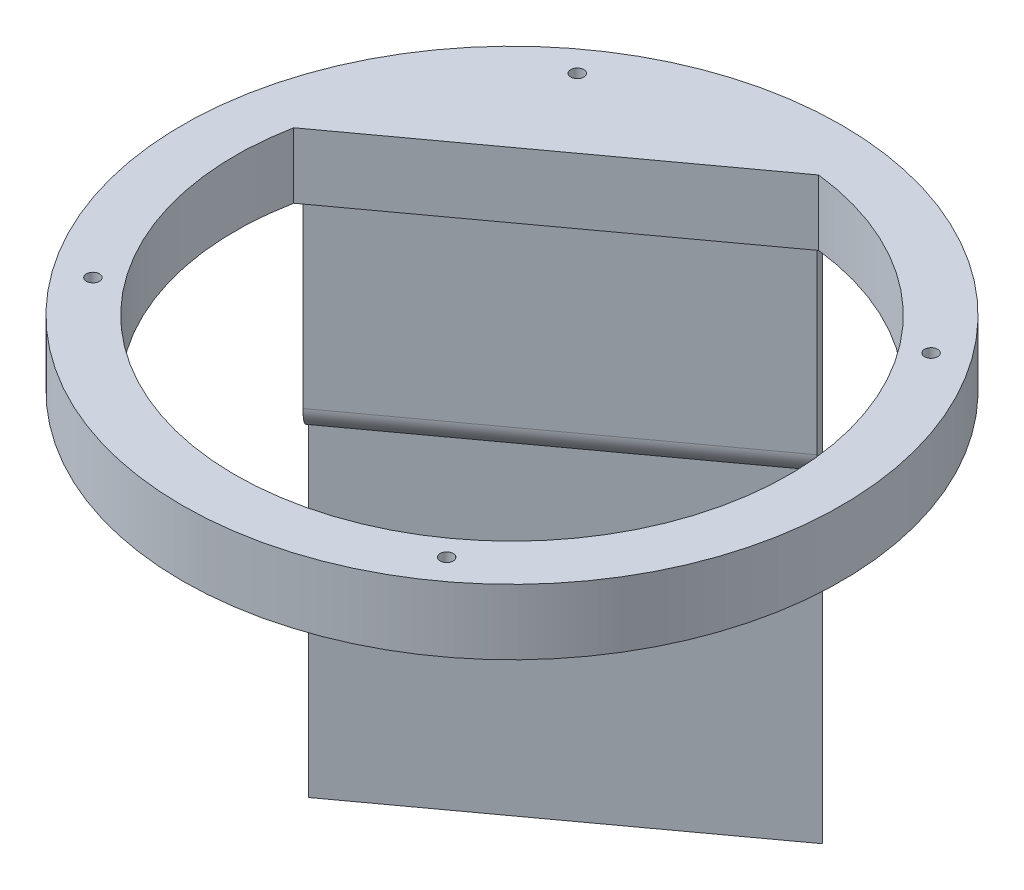
ISO-10303-21;
HEADER;
FILE_DESCRIPTION(('STEP AP214'),'2;1');
FILE_NAME('part.step','',(''),(''),'','','');
FILE_SCHEMA(('AUTOMOTIVE_DESIGN { 1 0 10303 214 1 1 1 1 }'));
ENDSEC;
DATA;
#1=APPLICATION_CONTEXT('core data for automotive mechanical design processes');
#2=APPLICATION_PROTOCOL_DEFINITION('international standard','automotive_design',2000,#1);
#3=PRODUCT_CONTEXT('',#1,'mechanical');
#4=PRODUCT('Part','Part','',(#3));
#5=PRODUCT_RELATED_PRODUCT_CATEGORY('part','',(#4));
#6=PRODUCT_DEFINITION_FORMATION('','',#4);
#7=PRODUCT_DEFINITION_CONTEXT('part definition',#1,'design');
#8=PRODUCT_DEFINITION('design','',#6,#7);
#9=PRODUCT_DEFINITION_SHAPE('','',#8);
#10=(LENGTH_UNIT() NAMED_UNIT(*) SI_UNIT(.MILLI.,.METRE.));
#11=(NAMED_UNIT(*) PLANE_ANGLE_UNIT() SI_UNIT($,.RADIAN.));
#12=(NAMED_UNIT(*) SI_UNIT($,.STERADIAN.) SOLID_ANGLE_UNIT());
#13=UNCERTAINTY_MEASURE_WITH_UNIT(LENGTH_MEASURE(1.E-05),#10,'distance_accuracy_value','');
#14=(GEOMETRIC_REPRESENTATION_CONTEXT(3) GLOBAL_UNCERTAINTY_ASSIGNED_CONTEXT((#13)) GLOBAL_UNIT_ASSIGNED_CONTEXT((#10,
#11,#12)) REPRESENTATION_CONTEXT('',''));
#15=CARTESIAN_POINT('',(0.,0.,0.));
#16=DIRECTION('',(0.,0.,1.));
#17=DIRECTION('',(1.,0.,0.));
#18=AXIS2_PLACEMENT_3D('',#15,#16,#17);
#19=CARTESIAN_POINT('',(0.,0.,0.));
#20=DIRECTION('',(0.,1.,0.));
#21=DIRECTION('',(0.,0.,1.));
#22=AXIS2_PLACEMENT_3D('',#19,#20,#21);
#23=PLANE('',#22);
#24=CARTESIAN_POINT('',(0.,0.,0.));
#25=DIRECTION('',(0.,1.,0.));
#26=DIRECTION('',(0.,0.,1.));
#27=AXIS2_PLACEMENT_3D('',#24,#25,#26);
#28=CIRCLE('',#27,75.63);
#29=CARTESIAN_POINT('',(0.,0.,75.63));
#30=VERTEX_POINT('',#29);
#31=EDGE_CURVE('E219',#30,#30,#28,.T.);
#32=ORIENTED_EDGE('',*,*,#31,.F.);
#33=EDGE_LOOP('',(#32));
#34=FACE_BOUND('',#33,.T.);
#35=CARTESIAN_POINT('',(0.,0.,0.));
#36=DIRECTION('',(0.,1.,0.));
#37=DIRECTION('',(0.,0.,1.));
#38=AXIS2_PLACEMENT_3D('',#35,#36,#37);
#39=CIRCLE('',#38,63.5);
#40=CARTESIAN_POINT('',(-62.3118029306201,0.,-12.2265782431375));
#41=VERTEX_POINT('',#40);
#42=CARTESIAN_POINT('',(7.31306950931665,0.,-63.0774842107063));
#43=VERTEX_POINT('',#42);
#44=EDGE_CURVE('E216',#41,#43,#39,.T.);
#45=ORIENTED_EDGE('',*,*,#44,.T.);
#46=DIRECTION('',(-0.807550267601541,0.,0.589798749826311));
#47=VECTOR('',#46,1.);
#48=CARTESIAN_POINT('',(7.31306950931663,0.,-63.0774842107063));
#49=LINE('',#48,#47);
#50=EDGE_CURVE('E205',#43,#41,#49,.T.);
#51=ORIENTED_EDGE('',*,*,#50,.T.);
#52=EDGE_LOOP('',(#45,#51));
#53=FACE_BOUND('',#52,.T.);
#54=CARTESIAN_POINT('',(-40.5928989567965,0.,-55.5796471676757));
#55=DIRECTION('',(0.,1.,0.));
#56=DIRECTION('',(0.,0.,1.));
#57=AXIS2_PLACEMENT_3D('',#54,#55,#56);
#58=CIRCLE('',#57,1.50000000000001);
#59=CARTESIAN_POINT('',(-40.5928989567965,0.,-54.0796471676757));
#60=VERTEX_POINT('',#59);
#61=EDGE_CURVE('E138',#60,#60,#58,.F.);
#62=ORIENTED_EDGE('',*,*,#61,.F.);
#63=EDGE_LOOP('',(#62));
#64=FACE_BOUND('',#63,.T.);
#65=CARTESIAN_POINT('',(55.5796471676757,0.,-40.5928989567965));
#66=DIRECTION('',(0.,1.,0.));
#67=DIRECTION('',(0.,0.,1.));
#68=AXIS2_PLACEMENT_3D('',#65,#66,#67);
#69=CIRCLE('',#68,1.5);
#70=CARTESIAN_POINT('',(55.5796471676757,0.,-39.0928989567965));
#71=VERTEX_POINT('',#70);
#72=EDGE_CURVE('E167',#71,#71,#69,.F.);
#73=ORIENTED_EDGE('',*,*,#72,.F.);
#74=EDGE_LOOP('',(#73));
#75=FACE_BOUND('',#74,.T.);
#76=CARTESIAN_POINT('',(-55.5796471676757,0.,40.5928989567965));
#77=DIRECTION('',(0.,1.,0.));
#78=DIRECTION('',(0.,0.,1.));
#79=AXIS2_PLACEMENT_3D('',#76,#77,#78);
#80=CIRCLE('',#79,1.5);
#81=CARTESIAN_POINT('',(-55.5796471676757,0.,42.0928989567965));
#82=VERTEX_POINT('',#81);
#83=EDGE_CURVE('E161',#82,#82,#80,.F.);
#84=ORIENTED_EDGE('',*,*,#83,.F.);
#85=EDGE_LOOP('',(#84));
#86=FACE_BOUND('',#85,.T.);
#87=CARTESIAN_POINT('',(40.5928989567965,0.,55.5796471676757));
#88=DIRECTION('',(0.,1.,0.));
#89=DIRECTION('',(0.,0.,1.));
#90=AXIS2_PLACEMENT_3D('',#87,#88,#89);
#91=CIRCLE('',#90,1.5);
#92=CARTESIAN_POINT('',(40.5928989567965,0.,57.0796471676757));
#93=VERTEX_POINT('',#92);
#94=EDGE_CURVE('E156',#93,#93,#91,.F.);
#95=ORIENTED_EDGE('',*,*,#94,.F.);
#96=EDGE_LOOP('',(#95));
#97=FACE_BOUND('',#96,.T.);
#98=DIRECTION('',(-0.589798749826309,0.,-0.807550267601542));
#99=VECTOR('',#98,1.);
#100=CARTESIAN_POINT('',(4.22637396438412,0.,-65.7763512830651));
#101=LINE('',#100,#99);
#102=CARTESIAN_POINT('',(4.22637396438412,0.,-65.7763512830651));
#103=VERTEX_POINT('',#102);
#104=CARTESIAN_POINT('',(0.687581465426267,0.,-70.6216528886744));
#105=VERTEX_POINT('',#104);
#106=EDGE_CURVE('E131',#103,#105,#101,.T.);
#107=ORIENTED_EDGE('',*,*,#106,.T.);
#108=CARTESIAN_POINT('',(0.,0.,0.));
#109=DIRECTION('',(0.,-1.,0.));
#110=DIRECTION('',(0.,0.,-1.));
#111=AXIS2_PLACEMENT_3D('',#108,#109,#110);
#112=CIRCLE('',#111,70.625);
#113=CARTESIAN_POINT('',(-15.1111896962606,0.,-68.9894381116677));
#114=VERTEX_POINT('',#113);
#115=EDGE_CURVE('E190',#114,#105,#112,.T.);
#116=ORIENTED_EDGE('',*,*,#115,.F.);
#117=DIRECTION('',(0.807550267601542,0.,-0.58979874982631));
#118=VECTOR('',#117,1.);
#119=CARTESIAN_POINT('',(-38.1157442075253,0.,-52.1879360437496));
#120=LINE('',#119,#118);
#121=CARTESIAN_POINT('',(-61.1202987187899,0.,-35.3864339758316));
#122=VERTEX_POINT('',#121);
#123=EDGE_CURVE('E160',#122,#114,#120,.T.);
#124=ORIENTED_EDGE('',*,*,#123,.F.);
#125=CARTESIAN_POINT('',(-67.4822898832558,0.,-20.8334149172004));
#126=VERTEX_POINT('',#125);
#127=EDGE_CURVE('E195',#126,#122,#112,.T.);
#128=ORIENTED_EDGE('',*,*,#127,.F.);
#129=DIRECTION('',(-0.589798749826309,0.,-0.807550267601542));
#130=VECTOR('',#129,1.);
#131=CARTESIAN_POINT('',(-63.943497384298,0.,-15.9881133115911));
#132=LINE('',#131,#130);
#133=CARTESIAN_POINT('',(-63.943497384298,0.,-15.9881133115911));
#134=VERTEX_POINT('',#133);
#135=EDGE_CURVE('E139',#134,#126,#132,.T.);
#136=ORIENTED_EDGE('',*,*,#135,.F.);
#137=DIRECTION('',(-0.807550267601542,0.,0.58979874982631));
#138=VECTOR('',#137,1.);
#139=CARTESIAN_POINT('',(-29.8585617099569,0.,-40.8822322973281));
#140=LINE('',#139,#138);
#141=EDGE_CURVE('E125',#103,#134,#140,.T.);
#142=ORIENTED_EDGE('',*,*,#141,.F.);
#143=EDGE_LOOP('',(#107,#116,#124,#128,#136,#142));
#144=FACE_BOUND('',#143,.T.);
#145=ADVANCED_FACE('F54',(#34,#53,#64,#75,#86,#97,#144),#23,.F.);
#146=CARTESIAN_POINT('',(0.,15.,0.));
#147=DIRECTION('',(0.,-1.,0.));
#148=DIRECTION('',(0.,0.,-1.));
#149=AXIS2_PLACEMENT_3D('',#146,#147,#148);
#150=CYLINDRICAL_SURFACE('',#149,75.63);
#151=CARTESIAN_POINT('',(0.,15.,0.));
#152=DIRECTION('',(0.,1.,0.));
#153=DIRECTION('',(0.,0.,1.));
#154=AXIS2_PLACEMENT_3D('',#151,#152,#153);
#155=CIRCLE('',#154,75.63);
#156=CARTESIAN_POINT('',(0.,15.,75.63));
#157=VERTEX_POINT('',#156);
#158=EDGE_CURVE('E222',#157,#157,#155,.T.);
#159=ORIENTED_EDGE('',*,*,#158,.F.);
#160=EDGE_LOOP('',(#159));
#161=FACE_BOUND('',#160,.T.);
#162=ORIENTED_EDGE('',*,*,#31,.T.);
#163=EDGE_LOOP('',(#162));
#164=FACE_BOUND('',#163,.T.);
#165=ADVANCED_FACE('F229',(#161,#164),#150,.T.);
#166=CARTESIAN_POINT('',(0.,15.,0.));
#167=DIRECTION('',(0.,1.,0.));
#168=DIRECTION('',(0.,0.,1.));
#169=AXIS2_PLACEMENT_3D('',#166,#167,#168);
#170=PLANE('',#169);
#171=CARTESIAN_POINT('',(40.5928989567965,15.,55.5796471676757));
#172=DIRECTION('',(0.,1.,0.));
#173=DIRECTION('',(0.,0.,1.));
#174=AXIS2_PLACEMENT_3D('',#171,#172,#173);
#175=CIRCLE('',#174,1.5);
#176=CARTESIAN_POINT('',(40.5928989567965,15.,57.0796471676757));
#177=VERTEX_POINT('',#176);
#178=EDGE_CURVE('E153',#177,#177,#175,.T.);
#179=ORIENTED_EDGE('',*,*,#178,.F.);
#180=EDGE_LOOP('',(#179));
#181=FACE_BOUND('',#180,.T.);
#182=CARTESIAN_POINT('',(-55.5796471676757,15.,40.5928989567965));
#183=DIRECTION('',(0.,1.,0.));
#184=DIRECTION('',(0.,0.,1.));
#185=AXIS2_PLACEMENT_3D('',#182,#183,#184);
#186=CIRCLE('',#185,1.5);
#187=CARTESIAN_POINT('',(-55.5796471676757,15.,42.0928989567965));
#188=VERTEX_POINT('',#187);
#189=EDGE_CURVE('E157',#188,#188,#186,.T.);
#190=ORIENTED_EDGE('',*,*,#189,.F.);
#191=EDGE_LOOP('',(#190));
#192=FACE_BOUND('',#191,.T.);
#193=CARTESIAN_POINT('',(55.5796471676757,15.,-40.5928989567965));
#194=DIRECTION('',(0.,1.,0.));
#195=DIRECTION('',(0.,0.,1.));
#196=AXIS2_PLACEMENT_3D('',#193,#194,#195);
#197=CIRCLE('',#196,1.5);
#198=CARTESIAN_POINT('',(55.5796471676757,15.,-39.0928989567965));
#199=VERTEX_POINT('',#198);
#200=EDGE_CURVE('E164',#199,#199,#197,.T.);
#201=ORIENTED_EDGE('',*,*,#200,.F.);
#202=EDGE_LOOP('',(#201));
#203=FACE_BOUND('',#202,.T.);
#204=CARTESIAN_POINT('',(-40.5928989567965,15.,-55.5796471676757));
#205=DIRECTION('',(0.,1.,0.));
#206=DIRECTION('',(0.,0.,1.));
#207=AXIS2_PLACEMENT_3D('',#204,#205,#206);
#208=CIRCLE('',#207,1.50000000000001);
#209=CARTESIAN_POINT('',(-40.5928989567965,15.,-54.0796471676757));
#210=VERTEX_POINT('',#209);
#211=EDGE_CURVE('E170',#210,#210,#208,.T.);
#212=ORIENTED_EDGE('',*,*,#211,.F.);
#213=EDGE_LOOP('',(#212));
#214=FACE_BOUND('',#213,.T.);
#215=CARTESIAN_POINT('',(0.,15.,0.));
#216=DIRECTION('',(0.,1.,0.));
#217=DIRECTION('',(0.,0.,1.));
#218=AXIS2_PLACEMENT_3D('',#215,#216,#217);
#219=CIRCLE('',#218,63.5);
#220=CARTESIAN_POINT('',(-62.3118029306201,15.,-12.2265782431375));
#221=VERTEX_POINT('',#220);
#222=CARTESIAN_POINT('',(7.31306950931665,15.,-63.0774842107063));
#223=VERTEX_POINT('',#222);
#224=EDGE_CURVE('E215',#221,#223,#219,.T.);
#225=ORIENTED_EDGE('',*,*,#224,.F.);
#226=DIRECTION('',(-0.807550267601541,0.,0.589798749826311));
#227=VECTOR('',#226,1.);
#228=CARTESIAN_POINT('',(7.31306950931663,15.,-63.0774842107063));
#229=LINE('',#228,#227);
#230=EDGE_CURVE('E209',#223,#221,#229,.T.);
#231=ORIENTED_EDGE('',*,*,#230,.F.);
#232=EDGE_LOOP('',(#225,#231));
#233=FACE_BOUND('',#232,.T.);
#234=ORIENTED_EDGE('',*,*,#158,.T.);
#235=EDGE_LOOP('',(#234));
#236=FACE_BOUND('',#235,.T.);
#237=ADVANCED_FACE('F251',(#181,#192,#203,#214,#233,#236),#170,.T.);
#238=CARTESIAN_POINT('',(0.,0.,0.));
#239=DIRECTION('',(0.,1.,0.));
#240=DIRECTION('',(0.,0.,1.));
#241=AXIS2_PLACEMENT_3D('',#238,#239,#240);
#242=CYLINDRICAL_SURFACE('',#241,63.5);
#243=ORIENTED_EDGE('',*,*,#224,.T.);
#244=DIRECTION('',(0.,-1.,0.));
#245=VECTOR('',#244,1.);
#246=CARTESIAN_POINT('',(7.31306950931665,101.467257623534,-63.0774842107063));
#247=LINE('',#246,#245);
#248=EDGE_CURVE('E208',#223,#43,#247,.T.);
#249=ORIENTED_EDGE('',*,*,#248,.T.);
#250=ORIENTED_EDGE('',*,*,#44,.F.);
#251=DIRECTION('',(0.,-1.,0.));
#252=VECTOR('',#251,1.);
#253=CARTESIAN_POINT('',(-62.3118029306201,101.467257623534,-12.2265782431375));
#254=LINE('',#253,#252);
#255=EDGE_CURVE('E211',#221,#41,#254,.T.);
#256=ORIENTED_EDGE('',*,*,#255,.F.);
#257=EDGE_LOOP('',(#243,#249,#250,#256));
#258=FACE_BOUND('',#257,.T.);
#259=ADVANCED_FACE('F254',(#258),#242,.F.);
#260=CARTESIAN_POINT('',(7.31306950931663,101.467257623534,-63.0774842107063));
#261=DIRECTION('',(0.589798749826311,0.,0.807550267601541));
#262=DIRECTION('',(0.807550267601541,0.,-0.589798749826311));
#263=AXIS2_PLACEMENT_3D('',#260,#261,#262);
#264=PLANE('',#263);
#265=ORIENTED_EDGE('',*,*,#248,.F.);
#266=ORIENTED_EDGE('',*,*,#230,.T.);
#267=ORIENTED_EDGE('',*,*,#255,.T.);
#268=ORIENTED_EDGE('',*,*,#50,.F.);
#269=EDGE_LOOP('',(#265,#266,#267,#268));
#270=FACE_BOUND('',#269,.T.);
#271=ADVANCED_FACE('F273',(#270),#264,.T.);
#272=CARTESIAN_POINT('',(-33.3973542089148,-125.,-45.7275339029373));
#273=DIRECTION('',(0.58979874982631,0.,0.807550267601542));
#274=DIRECTION('',(0.807550267601542,0.,-0.58979874982631));
#275=AXIS2_PLACEMENT_3D('',#272,#273,#274);
#276=PLANE('',#275);
#277=DIRECTION('',(-0.807550267601542,0.,0.58979874982631));
#278=VECTOR('',#277,1.);
#279=CARTESIAN_POINT('',(-33.3973542089148,-49.5,-45.7275339029374));
#280=LINE('',#279,#278);
#281=CARTESIAN_POINT('',(0.687581465426268,-49.5,-70.6216528886744));
#282=VERTEX_POINT('',#281);
#283=CARTESIAN_POINT('',(-67.4822898832558,-49.5,-20.8334149172004));
#284=VERTEX_POINT('',#283);
#285=EDGE_CURVE('E147',#282,#284,#280,.T.);
#286=ORIENTED_EDGE('',*,*,#285,.T.);
#287=DIRECTION('',(0.,1.,0.));
#288=VECTOR('',#287,1.);
#289=CARTESIAN_POINT('',(-67.4822898832558,-125.,-20.8334149172004));
#290=LINE('',#289,#288);
#291=CARTESIAN_POINT('',(-67.4822898832558,-125.,-20.8334149172004));
#292=VERTEX_POINT('',#291);
#293=EDGE_CURVE('E202',#292,#284,#290,.T.);
#294=ORIENTED_EDGE('',*,*,#293,.F.);
#295=DIRECTION('',(0.807550267601542,0.,-0.58979874982631));
#296=VECTOR('',#295,1.);
#297=CARTESIAN_POINT('',(-33.3973542089148,-125.,-45.7275339029373));
#298=LINE('',#297,#296);
#299=CARTESIAN_POINT('',(0.687581465426287,-125.,-70.6216528886743));
#300=VERTEX_POINT('',#299);
#301=EDGE_CURVE('E191',#292,#300,#298,.T.);
#302=ORIENTED_EDGE('',*,*,#301,.T.);
#303=DIRECTION('',(0.,1.,0.));
#304=VECTOR('',#303,1.);
#305=CARTESIAN_POINT('',(0.687581465426287,-125.,-70.6216528886743));
#306=LINE('',#305,#304);
#307=EDGE_CURVE('E197',#300,#282,#306,.T.);
#308=ORIENTED_EDGE('',*,*,#307,.T.);
#309=EDGE_LOOP('',(#286,#294,#302,#308));
#310=FACE_BOUND('',#309,.T.);
#311=ADVANCED_FACE('F277',(#310),#276,.T.);
#312=CARTESIAN_POINT('',(0.,-125.,0.));
#313=DIRECTION('',(0.,1.,0.));
#314=DIRECTION('',(0.,0.,1.));
#315=AXIS2_PLACEMENT_3D('',#312,#313,#314);
#316=CYLINDRICAL_SURFACE('',#315,70.625);
#317=CARTESIAN_POINT('',(0.,-100.,0.));
#318=DIRECTION('',(0.,-1.,0.));
#319=DIRECTION('',(0.,0.,-1.));
#320=AXIS2_PLACEMENT_3D('',#317,#318,#319);
#321=CIRCLE('',#320,70.625);
#322=CARTESIAN_POINT('',(-61.1202987187899,-100.,-35.3864339758316));
#323=VERTEX_POINT('',#322);
#324=CARTESIAN_POINT('',(-15.1111896962606,-100.,-68.9894381116677));
#325=VERTEX_POINT('',#324);
#326=EDGE_CURVE('E180',#323,#325,#321,.T.);
#327=ORIENTED_EDGE('',*,*,#326,.T.);
#328=DIRECTION('',(0.,1.,0.));
#329=VECTOR('',#328,1.);
#330=CARTESIAN_POINT('',(-15.1111896962606,-100.,-68.9894381116677));
#331=LINE('',#330,#329);
#332=EDGE_CURVE('E183',#325,#114,#331,.T.);
#333=ORIENTED_EDGE('',*,*,#332,.T.);
#334=ORIENTED_EDGE('',*,*,#115,.T.);
#335=DIRECTION('',(0.,1.,0.));
#336=VECTOR('',#335,1.);
#337=CARTESIAN_POINT('',(0.687581465426267,0.,-70.6216528886744));
#338=LINE('',#337,#336);
#339=EDGE_CURVE('E134',#282,#105,#338,.T.);
#340=ORIENTED_EDGE('',*,*,#339,.F.);
#341=ORIENTED_EDGE('',*,*,#307,.F.);
#342=CARTESIAN_POINT('',(0.,-125.,0.));
#343=DIRECTION('',(0.,-1.,0.));
#344=DIRECTION('',(0.,0.,-1.));
#345=AXIS2_PLACEMENT_3D('',#342,#343,#344);
#346=CIRCLE('',#345,70.625);
#347=EDGE_CURVE('E194',#292,#300,#346,.T.);
#348=ORIENTED_EDGE('',*,*,#347,.F.);
#349=ORIENTED_EDGE('',*,*,#293,.T.);
#350=DIRECTION('',(0.,-1.,0.));
#351=VECTOR('',#350,1.);
#352=CARTESIAN_POINT('',(-67.4822898832558,0.,-20.8334149172004));
#353=LINE('',#352,#351);
#354=EDGE_CURVE('E128',#126,#284,#353,.T.);
#355=ORIENTED_EDGE('',*,*,#354,.F.);
#356=ORIENTED_EDGE('',*,*,#127,.T.);
#357=DIRECTION('',(0.,1.,0.));
#358=VECTOR('',#357,1.);
#359=CARTESIAN_POINT('',(-61.1202987187899,-100.,-35.3864339758316));
#360=LINE('',#359,#358);
#361=EDGE_CURVE('E187',#323,#122,#360,.T.);
#362=ORIENTED_EDGE('',*,*,#361,.F.);
#363=EDGE_LOOP('',(#327,#333,#334,#340,#341,#348,#349,#355,#356,#362));
#364=FACE_BOUND('',#363,.T.);
#365=ADVANCED_FACE('F281',(#364),#316,.T.);
#366=CARTESIAN_POINT('',(0.,-125.,0.));
#367=DIRECTION('',(0.,-1.,0.));
#368=DIRECTION('',(0.,0.,-1.));
#369=AXIS2_PLACEMENT_3D('',#366,#367,#368);
#370=PLANE('',#369);
#371=ORIENTED_EDGE('',*,*,#301,.F.);
#372=ORIENTED_EDGE('',*,*,#347,.T.);
#373=EDGE_LOOP('',(#371,#372));
#374=FACE_BOUND('',#373,.T.);
#375=ADVANCED_FACE('F285',(#374),#370,.T.);
#376=CARTESIAN_POINT('',(-38.1157442075253,-100.,-52.1879360437496));
#377=DIRECTION('',(0.58979874982631,0.,0.807550267601542));
#378=DIRECTION('',(0.807550267601542,0.,-0.58979874982631));
#379=AXIS2_PLACEMENT_3D('',#376,#377,#378);
#380=PLANE('',#379);
#381=ORIENTED_EDGE('',*,*,#123,.T.);
#382=ORIENTED_EDGE('',*,*,#332,.F.);
#383=DIRECTION('',(0.807550267601542,0.,-0.58979874982631));
#384=VECTOR('',#383,1.);
#385=CARTESIAN_POINT('',(-38.1157442075253,-100.,-52.1879360437496));
#386=LINE('',#385,#384);
#387=EDGE_CURVE('E177',#323,#325,#386,.T.);
#388=ORIENTED_EDGE('',*,*,#387,.F.);
#389=ORIENTED_EDGE('',*,*,#361,.T.);
#390=EDGE_LOOP('',(#381,#382,#388,#389));
#391=FACE_BOUND('',#390,.T.);
#392=ADVANCED_FACE('F289',(#391),#380,.F.);
#393=CARTESIAN_POINT('',(0.,-100.,0.));
#394=DIRECTION('',(0.,-1.,0.));
#395=DIRECTION('',(0.,0.,-1.));
#396=AXIS2_PLACEMENT_3D('',#393,#394,#395);
#397=PLANE('',#396);
#398=ORIENTED_EDGE('',*,*,#387,.T.);
#399=ORIENTED_EDGE('',*,*,#326,.F.);
#400=EDGE_LOOP('',(#398,#399));
#401=FACE_BOUND('',#400,.T.);
#402=ADVANCED_FACE('F293',(#401),#397,.F.);
#403=CARTESIAN_POINT('',(-40.5928989567965,-4.24264068711931,-55.5796471676757));
#404=DIRECTION('',(0.,1.,0.));
#405=DIRECTION('',(0.,0.,1.));
#406=AXIS2_PLACEMENT_3D('',#403,#404,#405);
#407=CYLINDRICAL_SURFACE('',#406,1.50000000000001);
#408=ORIENTED_EDGE('',*,*,#61,.T.);
#409=EDGE_LOOP('',(#408));
#410=FACE_BOUND('',#409,.T.);
#411=ORIENTED_EDGE('',*,*,#211,.T.);
#412=EDGE_LOOP('',(#411));
#413=FACE_BOUND('',#412,.T.);
#414=ADVANCED_FACE('F297',(#410,#413),#407,.F.);
#415=CARTESIAN_POINT('',(55.5796471676757,-4.24264068711931,-40.5928989567965));
#416=DIRECTION('',(0.,1.,0.));
#417=DIRECTION('',(0.,0.,1.));
#418=AXIS2_PLACEMENT_3D('',#415,#416,#417);
#419=CYLINDRICAL_SURFACE('',#418,1.5);
#420=ORIENTED_EDGE('',*,*,#72,.T.);
#421=EDGE_LOOP('',(#420));
#422=FACE_BOUND('',#421,.T.);
#423=ORIENTED_EDGE('',*,*,#200,.T.);
#424=EDGE_LOOP('',(#423));
#425=FACE_BOUND('',#424,.T.);
#426=ADVANCED_FACE('F301',(#422,#425),#419,.F.);
#427=CARTESIAN_POINT('',(-55.5796471676757,-4.24264068711931,40.5928989567965));
#428=DIRECTION('',(0.,1.,0.));
#429=DIRECTION('',(0.,0.,1.));
#430=AXIS2_PLACEMENT_3D('',#427,#428,#429);
#431=CYLINDRICAL_SURFACE('',#430,1.5);
#432=ORIENTED_EDGE('',*,*,#83,.T.);
#433=EDGE_LOOP('',(#432));
#434=FACE_BOUND('',#433,.T.);
#435=ORIENTED_EDGE('',*,*,#189,.T.);
#436=EDGE_LOOP('',(#435));
#437=FACE_BOUND('',#436,.T.);
#438=ADVANCED_FACE('F247',(#434,#437),#431,.F.);
#439=CARTESIAN_POINT('',(40.5928989567965,-4.24264068711931,55.5796471676757));
#440=DIRECTION('',(0.,1.,0.));
#441=DIRECTION('',(0.,0.,1.));
#442=AXIS2_PLACEMENT_3D('',#439,#440,#441);
#443=CYLINDRICAL_SURFACE('',#442,1.5);
#444=ORIENTED_EDGE('',*,*,#94,.T.);
#445=EDGE_LOOP('',(#444));
#446=FACE_BOUND('',#445,.T.);
#447=ORIENTED_EDGE('',*,*,#178,.T.);
#448=EDGE_LOOP('',(#447));
#449=FACE_BOUND('',#448,.T.);
#450=ADVANCED_FACE('F244',(#446,#449),#443,.F.);
#451=CARTESIAN_POINT('',(4.22637396438412,0.,-65.7763512830651));
#452=DIRECTION('',(-0.807550267601542,0.,0.589798749826309));
#453=DIRECTION('',(0.589798749826309,0.,0.807550267601542));
#454=AXIS2_PLACEMENT_3D('',#451,#452,#453);
#455=PLANE('',#454);
#456=DIRECTION('',(0.,1.,0.));
#457=VECTOR('',#456,1.);
#458=CARTESIAN_POINT('',(4.22637396438412,0.,-65.7763512830651));
#459=LINE('',#458,#457);
#460=CARTESIAN_POINT('',(4.22637396438413,-43.5,-65.7763512830651));
#461=VERTEX_POINT('',#460);
#462=EDGE_CURVE('E121',#461,#103,#459,.T.);
#463=ORIENTED_EDGE('',*,*,#462,.F.);
#464=CARTESIAN_POINT('',(0.687581465426274,-43.5,-70.6216528886744));
#465=DIRECTION('',(-0.807550267601542,0.,0.589798749826309));
#466=DIRECTION('',(0.589798749826309,0.,0.807550267601542));
#467=AXIS2_PLACEMENT_3D('',#464,#465,#466);
#468=CIRCLE('',#467,6.);
#469=EDGE_CURVE('E12',#461,#282,#468,.F.);
#470=ORIENTED_EDGE('',*,*,#469,.T.);
#471=ORIENTED_EDGE('',*,*,#339,.T.);
#472=ORIENTED_EDGE('',*,*,#106,.F.);
#473=EDGE_LOOP('',(#463,#470,#471,#472));
#474=FACE_BOUND('',#473,.T.);
#475=ADVANCED_FACE('F132',(#474),#455,.F.);
#476=CARTESIAN_POINT('',(-63.943497384298,0.,-15.9881133115911));
#477=DIRECTION('',(0.807550267601542,0.,-0.589798749826309));
#478=DIRECTION('',(-0.589798749826309,0.,-0.807550267601542));
#479=AXIS2_PLACEMENT_3D('',#476,#477,#478);
#480=PLANE('',#479);
#481=ORIENTED_EDGE('',*,*,#354,.T.);
#482=CARTESIAN_POINT('',(-67.4822898832558,-43.5,-20.8334149172004));
#483=DIRECTION('',(0.807550267601542,0.,-0.589798749826309));
#484=DIRECTION('',(-0.589798749826309,0.,-0.807550267601542));
#485=AXIS2_PLACEMENT_3D('',#482,#483,#484);
#486=CIRCLE('',#485,6.);
#487=CARTESIAN_POINT('',(-63.943497384298,-43.5,-15.9881133115911));
#488=VERTEX_POINT('',#487);
#489=EDGE_CURVE('E76',#284,#488,#486,.F.);
#490=ORIENTED_EDGE('',*,*,#489,.T.);
#491=DIRECTION('',(0.,-1.,0.));
#492=VECTOR('',#491,1.);
#493=CARTESIAN_POINT('',(-63.943497384298,0.,-15.9881133115911));
#494=LINE('',#493,#492);
#495=EDGE_CURVE('E143',#134,#488,#494,.T.);
#496=ORIENTED_EDGE('',*,*,#495,.F.);
#497=ORIENTED_EDGE('',*,*,#135,.T.);
#498=EDGE_LOOP('',(#481,#490,#496,#497));
#499=FACE_BOUND('',#498,.T.);
#500=ADVANCED_FACE('F311',(#499),#480,.F.);
#501=CARTESIAN_POINT('',(-29.8585617099569,0.,-40.8822322973281));
#502=DIRECTION('',(0.58979874982631,0.,0.807550267601542));
#503=DIRECTION('',(0.807550267601542,0.,-0.58979874982631));
#504=AXIS2_PLACEMENT_3D('',#501,#502,#503);
#505=PLANE('',#504);
#506=ORIENTED_EDGE('',*,*,#495,.T.);
#507=DIRECTION('',(-0.807550267601542,0.,0.58979874982631));
#508=VECTOR('',#507,1.);
#509=CARTESIAN_POINT('',(-29.8585617099569,-43.5,-40.8822322973281));
#510=LINE('',#509,#508);
#511=EDGE_CURVE('E62',#488,#461,#510,.F.);
#512=ORIENTED_EDGE('',*,*,#511,.T.);
#513=ORIENTED_EDGE('',*,*,#462,.T.);
#514=ORIENTED_EDGE('',*,*,#141,.T.);
#515=EDGE_LOOP('',(#506,#512,#513,#514));
#516=FACE_BOUND('',#515,.T.);
#517=ADVANCED_FACE('F123',(#516),#505,.T.);
#518=CARTESIAN_POINT('',(-33.3973542089148,-43.5,-45.7275339029374));
#519=DIRECTION('',(-0.807550267601542,0.,0.58979874982631));
#520=DIRECTION('',(0.58979874982631,0.,0.807550267601542));
#521=AXIS2_PLACEMENT_3D('',#518,#519,#520);
#522=CYLINDRICAL_SURFACE('',#521,6.);
#523=ORIENTED_EDGE('',*,*,#469,.F.);
#524=ORIENTED_EDGE('',*,*,#511,.F.);
#525=ORIENTED_EDGE('',*,*,#489,.F.);
#526=ORIENTED_EDGE('',*,*,#285,.F.);
#527=EDGE_LOOP('',(#523,#524,#525,#526));
#528=FACE_BOUND('',#527,.T.);
#529=ADVANCED_FACE('F56',(#528),#522,.T.);
#530=CLOSED_SHELL('',(#145,#165,#237,#259,#271,#311,#365,#375,#392,#402,#414,#426,#438,#450,
#475,#500,#517,#529));
#531=MANIFOLD_SOLID_BREP('B2',#530);
#532=ADVANCED_BREP_SHAPE_REPRESENTATION('',(#18,#531),#14);
#533=SHAPE_DEFINITION_REPRESENTATION(#9,#532);
ENDSEC;
END-ISO-10303-21;
